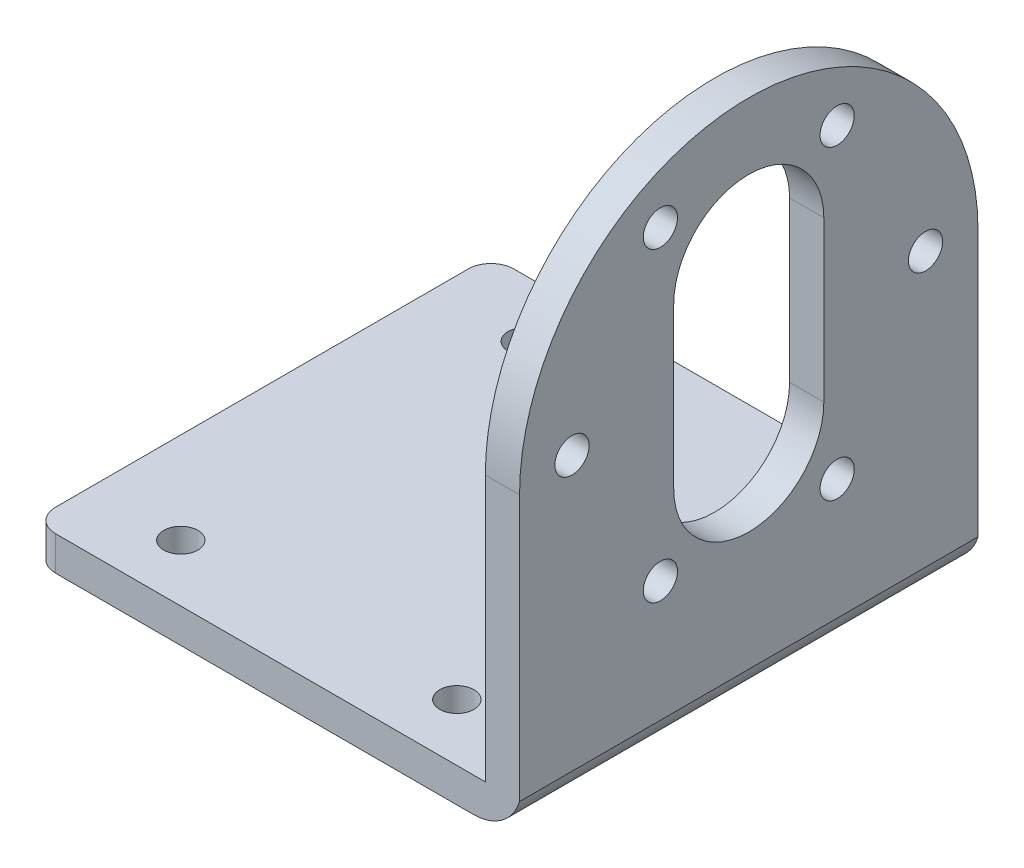
ISO-10303-21;
HEADER;
FILE_DESCRIPTION(('STEP AP214'),'2;1');
FILE_NAME('part.step','',(''),(''),'','','');
FILE_SCHEMA(('AUTOMOTIVE_DESIGN { 1 0 10303 214 1 1 1 1 }'));
ENDSEC;
DATA;
#1=APPLICATION_CONTEXT('core data for automotive mechanical design processes');
#2=APPLICATION_PROTOCOL_DEFINITION('international standard','automotive_design',2000,#1);
#3=PRODUCT_CONTEXT('',#1,'mechanical');
#4=PRODUCT('Part','Part','',(#3));
#5=PRODUCT_RELATED_PRODUCT_CATEGORY('part','',(#4));
#6=PRODUCT_DEFINITION_FORMATION('','',#4);
#7=PRODUCT_DEFINITION_CONTEXT('part definition',#1,'design');
#8=PRODUCT_DEFINITION('design','',#6,#7);
#9=PRODUCT_DEFINITION_SHAPE('','',#8);
#10=(LENGTH_UNIT() NAMED_UNIT(*) SI_UNIT(.MILLI.,.METRE.));
#11=(NAMED_UNIT(*) PLANE_ANGLE_UNIT() SI_UNIT($,.RADIAN.));
#12=(NAMED_UNIT(*) SI_UNIT($,.STERADIAN.) SOLID_ANGLE_UNIT());
#13=UNCERTAINTY_MEASURE_WITH_UNIT(LENGTH_MEASURE(1.E-05),#10,'distance_accuracy_value','');
#14=(GEOMETRIC_REPRESENTATION_CONTEXT(3) GLOBAL_UNCERTAINTY_ASSIGNED_CONTEXT((#13)) GLOBAL_UNIT_ASSIGNED_CONTEXT((#10,
#11,#12)) REPRESENTATION_CONTEXT('',''));
#15=CARTESIAN_POINT('',(0.,0.,0.));
#16=DIRECTION('',(0.,0.,1.));
#17=DIRECTION('',(1.,0.,0.));
#18=AXIS2_PLACEMENT_3D('',#15,#16,#17);
#19=CARTESIAN_POINT('',(0.,3.,40.2));
#20=DIRECTION('',(-1.,0.,0.));
#21=DIRECTION('',(0.,-1.,0.));
#22=AXIS2_PLACEMENT_3D('',#19,#20,#21);
#23=PLANE('',#22);
#24=CARTESIAN_POINT('',(0.,27.,35.6));
#25=DIRECTION('',(1.,0.,0.));
#26=DIRECTION('',(0.,1.,0.));
#27=AXIS2_PLACEMENT_3D('',#24,#25,#26);
#28=CIRCLE('',#27,1.5);
#29=CARTESIAN_POINT('',(0.,28.5,35.6));
#30=VERTEX_POINT('',#29);
#31=EDGE_CURVE('E234',#30,#30,#28,.T.);
#32=ORIENTED_EDGE('',*,*,#31,.F.);
#33=EDGE_LOOP('',(#32));
#34=FACE_BOUND('',#33,.T.);
#35=CARTESIAN_POINT('',(0.,13.5766062413413,27.8500000000002));
#36=DIRECTION('',(1.,0.,0.));
#37=DIRECTION('',(0.,1.,0.));
#38=AXIS2_PLACEMENT_3D('',#35,#36,#37);
#39=CIRCLE('',#38,1.50000000000001);
#40=CARTESIAN_POINT('',(0.,15.0766062413413,27.8500000000002));
#41=VERTEX_POINT('',#40);
#42=EDGE_CURVE('E402',#41,#41,#39,.T.);
#43=ORIENTED_EDGE('',*,*,#42,.F.);
#44=EDGE_LOOP('',(#43));
#45=FACE_BOUND('',#44,.T.);
#46=CARTESIAN_POINT('',(0.,13.5766062413411,12.3500000000001));
#47=DIRECTION('',(1.,0.,0.));
#48=DIRECTION('',(0.,1.,0.));
#49=AXIS2_PLACEMENT_3D('',#46,#47,#48);
#50=CIRCLE('',#49,1.5);
#51=CARTESIAN_POINT('',(0.,15.0766062413411,12.3500000000001));
#52=VERTEX_POINT('',#51);
#53=EDGE_CURVE('E409',#52,#52,#50,.T.);
#54=ORIENTED_EDGE('',*,*,#53,.F.);
#55=EDGE_LOOP('',(#54));
#56=FACE_BOUND('',#55,.T.);
#57=CARTESIAN_POINT('',(0.,26.9999999999999,4.6));
#58=DIRECTION('',(1.,0.,0.));
#59=DIRECTION('',(0.,1.,0.));
#60=AXIS2_PLACEMENT_3D('',#57,#58,#59);
#61=CIRCLE('',#60,1.50000000000001);
#62=CARTESIAN_POINT('',(0.,28.4999999999999,4.6));
#63=VERTEX_POINT('',#62);
#64=EDGE_CURVE('E415',#63,#63,#61,.T.);
#65=ORIENTED_EDGE('',*,*,#64,.F.);
#66=EDGE_LOOP('',(#65));
#67=FACE_BOUND('',#66,.T.);
#68=CARTESIAN_POINT('',(0.,40.4233937586588,12.3499999999999));
#69=DIRECTION('',(1.,0.,0.));
#70=DIRECTION('',(0.,1.,0.));
#71=AXIS2_PLACEMENT_3D('',#68,#69,#70);
#72=CIRCLE('',#71,1.5);
#73=CARTESIAN_POINT('',(0.,41.9233937586588,12.3499999999999));
#74=VERTEX_POINT('',#73);
#75=EDGE_CURVE('E412',#74,#74,#72,.T.);
#76=ORIENTED_EDGE('',*,*,#75,.F.);
#77=EDGE_LOOP('',(#76));
#78=FACE_BOUND('',#77,.T.);
#79=CARTESIAN_POINT('',(0.,40.4233937586588,27.85));
#80=DIRECTION('',(1.,0.,0.));
#81=DIRECTION('',(0.,1.,0.));
#82=AXIS2_PLACEMENT_3D('',#79,#80,#81);
#83=CIRCLE('',#82,1.5);
#84=CARTESIAN_POINT('',(0.,41.9233937586588,27.85));
#85=VERTEX_POINT('',#84);
#86=EDGE_CURVE('E406',#85,#85,#83,.T.);
#87=ORIENTED_EDGE('',*,*,#86,.F.);
#88=EDGE_LOOP('',(#87));
#89=FACE_BOUND('',#88,.T.);
#90=DIRECTION('',(0.,-1.,0.));
#91=VECTOR('',#90,1.);
#92=CARTESIAN_POINT('',(0.,34.,26.68));
#93=LINE('',#92,#91);
#94=CARTESIAN_POINT('',(0.,34.,26.68));
#95=VERTEX_POINT('',#94);
#96=CARTESIAN_POINT('',(0.,20.,26.68));
#97=VERTEX_POINT('',#96);
#98=EDGE_CURVE('E153',#95,#97,#93,.T.);
#99=ORIENTED_EDGE('',*,*,#98,.F.);
#100=CARTESIAN_POINT('',(0.,34.,20.1));
#101=DIRECTION('',(1.,0.,0.));
#102=DIRECTION('',(0.,1.,0.));
#103=AXIS2_PLACEMENT_3D('',#100,#101,#102);
#104=CIRCLE('',#103,6.58);
#105=CARTESIAN_POINT('',(0.,34.,13.52));
#106=VERTEX_POINT('',#105);
#107=EDGE_CURVE('E158',#106,#95,#104,.T.);
#108=ORIENTED_EDGE('',*,*,#107,.F.);
#109=DIRECTION('',(0.,1.,0.));
#110=VECTOR('',#109,1.);
#111=CARTESIAN_POINT('',(0.,34.,13.52));
#112=LINE('',#111,#110);
#113=CARTESIAN_POINT('',(0.,20.,13.52));
#114=VERTEX_POINT('',#113);
#115=EDGE_CURVE('E162',#114,#106,#112,.T.);
#116=ORIENTED_EDGE('',*,*,#115,.F.);
#117=CARTESIAN_POINT('',(0.,20.,20.1));
#118=DIRECTION('',(1.,0.,0.));
#119=DIRECTION('',(0.,1.,0.));
#120=AXIS2_PLACEMENT_3D('',#117,#118,#119);
#121=CIRCLE('',#120,6.58);
#122=EDGE_CURVE('E142',#97,#114,#121,.T.);
#123=ORIENTED_EDGE('',*,*,#122,.F.);
#124=EDGE_LOOP('',(#99,#108,#116,#123));
#125=FACE_BOUND('',#124,.T.);
#126=CARTESIAN_POINT('',(0.,26.3,20.1));
#127=DIRECTION('',(1.,0.,0.));
#128=DIRECTION('',(0.,1.,0.));
#129=AXIS2_PLACEMENT_3D('',#126,#127,#128);
#130=CIRCLE('',#129,20.1);
#131=CARTESIAN_POINT('',(0.,26.3,0.));
#132=VERTEX_POINT('',#131);
#133=CARTESIAN_POINT('',(0.,26.3,40.2));
#134=VERTEX_POINT('',#133);
#135=EDGE_CURVE('E169',#132,#134,#130,.T.);
#136=ORIENTED_EDGE('',*,*,#135,.T.);
#137=DIRECTION('',(0.,1.,0.));
#138=VECTOR('',#137,1.);
#139=CARTESIAN_POINT('',(0.,3.,40.2));
#140=LINE('',#139,#138);
#141=CARTESIAN_POINT('',(0.,3.,40.2));
#142=VERTEX_POINT('',#141);
#143=EDGE_CURVE('E179',#142,#134,#140,.T.);
#144=ORIENTED_EDGE('',*,*,#143,.F.);
#145=DIRECTION('',(0.,0.,-1.));
#146=VECTOR('',#145,1.);
#147=CARTESIAN_POINT('',(0.,3.,40.2));
#148=LINE('',#147,#146);
#149=CARTESIAN_POINT('',(0.,3.,0.));
#150=VERTEX_POINT('',#149);
#151=EDGE_CURVE('E211',#142,#150,#148,.T.);
#152=ORIENTED_EDGE('',*,*,#151,.T.);
#153=DIRECTION('',(0.,1.,0.));
#154=VECTOR('',#153,1.);
#155=CARTESIAN_POINT('',(0.,3.,0.));
#156=LINE('',#155,#154);
#157=EDGE_CURVE('E192',#150,#132,#156,.T.);
#158=ORIENTED_EDGE('',*,*,#157,.T.);
#159=EDGE_LOOP('',(#136,#144,#152,#158));
#160=FACE_BOUND('',#159,.T.);
#161=ADVANCED_FACE('F38',(#34,#45,#56,#67,#78,#89,#125,#160),#23,.F.);
#162=CARTESIAN_POINT('',(-3.,46.4,40.2));
#163=DIRECTION('',(1.,0.,0.));
#164=DIRECTION('',(0.,1.,0.));
#165=AXIS2_PLACEMENT_3D('',#162,#163,#164);
#166=PLANE('',#165);
#167=CARTESIAN_POINT('',(-3.,27.,35.6));
#168=DIRECTION('',(1.,0.,0.));
#169=DIRECTION('',(0.,1.,0.));
#170=AXIS2_PLACEMENT_3D('',#167,#168,#169);
#171=CIRCLE('',#170,1.5);
#172=CARTESIAN_POINT('',(-3.,28.5,35.6));
#173=VERTEX_POINT('',#172);
#174=EDGE_CURVE('E246',#173,#173,#171,.T.);
#175=ORIENTED_EDGE('',*,*,#174,.T.);
#176=EDGE_LOOP('',(#175));
#177=FACE_BOUND('',#176,.T.);
#178=CARTESIAN_POINT('',(-3.,13.5766062413413,27.8500000000002));
#179=DIRECTION('',(1.,0.,0.));
#180=DIRECTION('',(0.,1.,0.));
#181=AXIS2_PLACEMENT_3D('',#178,#179,#180);
#182=CIRCLE('',#181,1.50000000000001);
#183=CARTESIAN_POINT('',(-3.,15.0766062413413,27.8500000000002));
#184=VERTEX_POINT('',#183);
#185=EDGE_CURVE('E243',#184,#184,#182,.T.);
#186=ORIENTED_EDGE('',*,*,#185,.T.);
#187=EDGE_LOOP('',(#186));
#188=FACE_BOUND('',#187,.T.);
#189=CARTESIAN_POINT('',(-3.,13.5766062413411,12.3500000000001));
#190=DIRECTION('',(1.,0.,0.));
#191=DIRECTION('',(0.,1.,0.));
#192=AXIS2_PLACEMENT_3D('',#189,#190,#191);
#193=CIRCLE('',#192,1.5);
#194=CARTESIAN_POINT('',(-3.,15.0766062413411,12.3500000000001));
#195=VERTEX_POINT('',#194);
#196=EDGE_CURVE('E240',#195,#195,#193,.T.);
#197=ORIENTED_EDGE('',*,*,#196,.T.);
#198=EDGE_LOOP('',(#197));
#199=FACE_BOUND('',#198,.T.);
#200=CARTESIAN_POINT('',(-3.,26.9999999999999,4.6));
#201=DIRECTION('',(1.,0.,0.));
#202=DIRECTION('',(0.,1.,0.));
#203=AXIS2_PLACEMENT_3D('',#200,#201,#202);
#204=CIRCLE('',#203,1.50000000000001);
#205=CARTESIAN_POINT('',(-3.,28.4999999999999,4.6));
#206=VERTEX_POINT('',#205);
#207=EDGE_CURVE('E237',#206,#206,#204,.T.);
#208=ORIENTED_EDGE('',*,*,#207,.T.);
#209=EDGE_LOOP('',(#208));
#210=FACE_BOUND('',#209,.T.);
#211=CARTESIAN_POINT('',(-3.,40.4233937586588,12.3499999999999));
#212=DIRECTION('',(1.,0.,0.));
#213=DIRECTION('',(0.,1.,0.));
#214=AXIS2_PLACEMENT_3D('',#211,#212,#213);
#215=CIRCLE('',#214,1.5);
#216=CARTESIAN_POINT('',(-3.,41.9233937586588,12.3499999999999));
#217=VERTEX_POINT('',#216);
#218=EDGE_CURVE('E233',#217,#217,#215,.T.);
#219=ORIENTED_EDGE('',*,*,#218,.T.);
#220=EDGE_LOOP('',(#219));
#221=FACE_BOUND('',#220,.T.);
#222=CARTESIAN_POINT('',(-3.,40.4233937586588,27.85));
#223=DIRECTION('',(1.,0.,0.));
#224=DIRECTION('',(0.,1.,0.));
#225=AXIS2_PLACEMENT_3D('',#222,#223,#224);
#226=CIRCLE('',#225,1.5);
#227=CARTESIAN_POINT('',(-3.,41.9233937586588,27.85));
#228=VERTEX_POINT('',#227);
#229=EDGE_CURVE('E230',#228,#228,#226,.T.);
#230=ORIENTED_EDGE('',*,*,#229,.T.);
#231=EDGE_LOOP('',(#230));
#232=FACE_BOUND('',#231,.T.);
#233=DIRECTION('',(0.,1.,0.));
#234=VECTOR('',#233,1.);
#235=CARTESIAN_POINT('',(-3.,46.4,13.52));
#236=LINE('',#235,#234);
#237=CARTESIAN_POINT('',(-3.,20.,13.52));
#238=VERTEX_POINT('',#237);
#239=CARTESIAN_POINT('',(-3.,34.,13.52));
#240=VERTEX_POINT('',#239);
#241=EDGE_CURVE('E223',#238,#240,#236,.T.);
#242=ORIENTED_EDGE('',*,*,#241,.T.);
#243=CARTESIAN_POINT('',(-3.,34.,20.1));
#244=DIRECTION('',(1.,0.,0.));
#245=DIRECTION('',(0.,1.,0.));
#246=AXIS2_PLACEMENT_3D('',#243,#244,#245);
#247=CIRCLE('',#246,6.58);
#248=CARTESIAN_POINT('',(-3.,34.,26.68));
#249=VERTEX_POINT('',#248);
#250=EDGE_CURVE('E226',#240,#249,#247,.T.);
#251=ORIENTED_EDGE('',*,*,#250,.T.);
#252=DIRECTION('',(0.,-1.,0.));
#253=VECTOR('',#252,1.);
#254=CARTESIAN_POINT('',(-3.,46.4,26.68));
#255=LINE('',#254,#253);
#256=CARTESIAN_POINT('',(-3.,20.,26.68));
#257=VERTEX_POINT('',#256);
#258=EDGE_CURVE('E220',#249,#257,#255,.T.);
#259=ORIENTED_EDGE('',*,*,#258,.T.);
#260=CARTESIAN_POINT('',(-3.,20.,20.1));
#261=DIRECTION('',(1.,0.,0.));
#262=DIRECTION('',(0.,1.,0.));
#263=AXIS2_PLACEMENT_3D('',#260,#261,#262);
#264=CIRCLE('',#263,6.58);
#265=EDGE_CURVE('E145',#257,#238,#264,.T.);
#266=ORIENTED_EDGE('',*,*,#265,.T.);
#267=EDGE_LOOP('',(#242,#251,#259,#266));
#268=FACE_BOUND('',#267,.T.);
#269=DIRECTION('',(0.,-1.,0.));
#270=VECTOR('',#269,1.);
#271=CARTESIAN_POINT('',(-3.,46.4,40.2));
#272=LINE('',#271,#270);
#273=CARTESIAN_POINT('',(-3.,26.3,40.2));
#274=VERTEX_POINT('',#273);
#275=CARTESIAN_POINT('',(-2.99999999999999,3.00000000000001,40.2));
#276=VERTEX_POINT('',#275);
#277=EDGE_CURVE('E183',#274,#276,#272,.T.);
#278=ORIENTED_EDGE('',*,*,#277,.F.);
#279=CARTESIAN_POINT('',(-3.,26.3,20.1));
#280=DIRECTION('',(1.,0.,0.));
#281=DIRECTION('',(0.,1.,0.));
#282=AXIS2_PLACEMENT_3D('',#279,#280,#281);
#283=CIRCLE('',#282,20.1);
#284=CARTESIAN_POINT('',(-3.,26.3,0.));
#285=VERTEX_POINT('',#284);
#286=EDGE_CURVE('E173',#285,#274,#283,.T.);
#287=ORIENTED_EDGE('',*,*,#286,.F.);
#288=DIRECTION('',(0.,-1.,0.));
#289=VECTOR('',#288,1.);
#290=CARTESIAN_POINT('',(-3.,46.4,0.));
#291=LINE('',#290,#289);
#292=CARTESIAN_POINT('',(-2.99999999999999,3.00000000000001,0.));
#293=VERTEX_POINT('',#292);
#294=EDGE_CURVE('E195',#285,#293,#291,.T.);
#295=ORIENTED_EDGE('',*,*,#294,.T.);
#296=DIRECTION('',(0.,0.,-1.));
#297=VECTOR('',#296,1.);
#298=CARTESIAN_POINT('',(-2.99999999999999,3.00000000000001,40.2));
#299=LINE('',#298,#297);
#300=EDGE_CURVE('E208',#276,#293,#299,.T.);
#301=ORIENTED_EDGE('',*,*,#300,.F.);
#302=EDGE_LOOP('',(#278,#287,#295,#301));
#303=FACE_BOUND('',#302,.T.);
#304=ADVANCED_FACE('F292',(#177,#188,#199,#210,#221,#232,#268,#303),#166,.F.);
#305=CARTESIAN_POINT('',(-4.0422881334692,4.22334889233098,40.2));
#306=DIRECTION('',(0.,0.,-1.));
#307=DIRECTION('',(-1.,0.,0.));
#308=AXIS2_PLACEMENT_3D('',#305,#306,#307);
#309=CYLINDRICAL_SURFACE('',#308,4.22334889233098);
#310=CARTESIAN_POINT('',(-4.0422881334692,4.22334889233098,0.));
#311=DIRECTION('',(0.,0.,1.));
#312=DIRECTION('',(1.,0.,0.));
#313=AXIS2_PLACEMENT_3D('',#310,#311,#312);
#314=CIRCLE('',#313,4.22334889233098);
#315=CARTESIAN_POINT('',(-4.0422881334692,0.,0.));
#316=VERTEX_POINT('',#315);
#317=EDGE_CURVE('E175',#316,#150,#314,.T.);
#318=ORIENTED_EDGE('',*,*,#317,.T.);
#319=ORIENTED_EDGE('',*,*,#151,.F.);
#320=CARTESIAN_POINT('',(-4.0422881334692,4.22334889233098,40.2));
#321=DIRECTION('',(0.,0.,1.));
#322=DIRECTION('',(1.,0.,0.));
#323=AXIS2_PLACEMENT_3D('',#320,#321,#322);
#324=CIRCLE('',#323,4.22334889233098);
#325=CARTESIAN_POINT('',(-4.0422881334692,0.,40.2));
#326=VERTEX_POINT('',#325);
#327=EDGE_CURVE('E176',#326,#142,#324,.T.);
#328=ORIENTED_EDGE('',*,*,#327,.F.);
#329=DIRECTION('',(0.,0.,-1.));
#330=VECTOR('',#329,1.);
#331=CARTESIAN_POINT('',(-4.0422881334692,0.,40.2));
#332=LINE('',#331,#330);
#333=EDGE_CURVE('E189',#326,#316,#332,.T.);
#334=ORIENTED_EDGE('',*,*,#333,.T.);
#335=EDGE_LOOP('',(#318,#319,#328,#334));
#336=FACE_BOUND('',#335,.T.);
#337=ADVANCED_FACE('F274',(#336),#309,.T.);
#338=CARTESIAN_POINT('',(-2.99999999999999,3.00000000000001,40.2));
#339=DIRECTION('',(0.,-1.,0.));
#340=DIRECTION('',(1.,0.,0.));
#341=AXIS2_PLACEMENT_3D('',#338,#339,#340);
#342=PLANE('',#341);
#343=CARTESIAN_POINT('',(-34.7,3.,5.));
#344=DIRECTION('',(0.,1.,0.));
#345=DIRECTION('',(-1.,0.,0.));
#346=AXIS2_PLACEMENT_3D('',#343,#344,#345);
#347=CIRCLE('',#346,1.5);
#348=CARTESIAN_POINT('',(-36.2,3.,5.));
#349=VERTEX_POINT('',#348);
#350=EDGE_CURVE('E395',#349,#349,#347,.T.);
#351=ORIENTED_EDGE('',*,*,#350,.F.);
#352=EDGE_LOOP('',(#351));
#353=FACE_BOUND('',#352,.T.);
#354=CARTESIAN_POINT('',(-34.7,3.,35.2));
#355=DIRECTION('',(0.,1.,0.));
#356=DIRECTION('',(-1.,0.,0.));
#357=AXIS2_PLACEMENT_3D('',#354,#355,#356);
#358=CIRCLE('',#357,1.5);
#359=CARTESIAN_POINT('',(-36.2,3.,35.2));
#360=VERTEX_POINT('',#359);
#361=EDGE_CURVE('E387',#360,#360,#358,.T.);
#362=ORIENTED_EDGE('',*,*,#361,.F.);
#363=EDGE_LOOP('',(#362));
#364=FACE_BOUND('',#363,.T.);
#365=CARTESIAN_POINT('',(-10.5,3.,35.2));
#366=DIRECTION('',(0.,1.,0.));
#367=DIRECTION('',(-1.,0.,0.));
#368=AXIS2_PLACEMENT_3D('',#365,#366,#367);
#369=CIRCLE('',#368,1.5);
#370=CARTESIAN_POINT('',(-12.,3.,35.2));
#371=VERTEX_POINT('',#370);
#372=EDGE_CURVE('E380',#371,#371,#369,.T.);
#373=ORIENTED_EDGE('',*,*,#372,.F.);
#374=EDGE_LOOP('',(#373));
#375=FACE_BOUND('',#374,.T.);
#376=CARTESIAN_POINT('',(-10.5,3.,5.));
#377=DIRECTION('',(0.,1.,0.));
#378=DIRECTION('',(-1.,0.,0.));
#379=AXIS2_PLACEMENT_3D('',#376,#377,#378);
#380=CIRCLE('',#379,1.5);
#381=CARTESIAN_POINT('',(-12.,3.,5.));
#382=VERTEX_POINT('',#381);
#383=EDGE_CURVE('E382',#382,#382,#380,.T.);
#384=ORIENTED_EDGE('',*,*,#383,.F.);
#385=EDGE_LOOP('',(#384));
#386=FACE_BOUND('',#385,.T.);
#387=DIRECTION('',(-1.,0.,0.));
#388=VECTOR('',#387,1.);
#389=CARTESIAN_POINT('',(-2.99999999999999,3.00000000000001,0.));
#390=LINE('',#389,#388);
#391=CARTESIAN_POINT('',(-40.7,2.99999999999999,0.));
#392=VERTEX_POINT('',#391);
#393=EDGE_CURVE('E197',#293,#392,#390,.T.);
#394=ORIENTED_EDGE('',*,*,#393,.T.);
#395=CARTESIAN_POINT('',(-40.7,2.99999999999999,2.));
#396=DIRECTION('',(0.,-1.,0.));
#397=DIRECTION('',(1.,0.,0.));
#398=AXIS2_PLACEMENT_3D('',#395,#396,#397);
#399=CIRCLE('',#398,2.);
#400=CARTESIAN_POINT('',(-42.7,2.99999999999999,2.));
#401=VERTEX_POINT('',#400);
#402=EDGE_CURVE('E46',#392,#401,#399,.F.);
#403=ORIENTED_EDGE('',*,*,#402,.T.);
#404=DIRECTION('',(0.,0.,-1.));
#405=VECTOR('',#404,1.);
#406=CARTESIAN_POINT('',(-42.7,2.99999999999999,40.2));
#407=LINE('',#406,#405);
#408=CARTESIAN_POINT('',(-42.7,2.99999999999999,38.2));
#409=VERTEX_POINT('',#408);
#410=EDGE_CURVE('E205',#409,#401,#407,.T.);
#411=ORIENTED_EDGE('',*,*,#410,.F.);
#412=CARTESIAN_POINT('',(-40.7,2.99999999999999,38.2));
#413=DIRECTION('',(0.,-1.,0.));
#414=DIRECTION('',(1.,0.,0.));
#415=AXIS2_PLACEMENT_3D('',#412,#413,#414);
#416=CIRCLE('',#415,2.);
#417=CARTESIAN_POINT('',(-40.7,2.99999999999999,40.2));
#418=VERTEX_POINT('',#417);
#419=EDGE_CURVE('E53',#409,#418,#416,.F.);
#420=ORIENTED_EDGE('',*,*,#419,.T.);
#421=DIRECTION('',(-1.,0.,0.));
#422=VECTOR('',#421,1.);
#423=CARTESIAN_POINT('',(-2.99999999999999,3.00000000000001,40.2));
#424=LINE('',#423,#422);
#425=EDGE_CURVE('E185',#276,#418,#424,.T.);
#426=ORIENTED_EDGE('',*,*,#425,.F.);
#427=ORIENTED_EDGE('',*,*,#300,.T.);
#428=EDGE_LOOP('',(#394,#403,#411,#420,#426,#427));
#429=FACE_BOUND('',#428,.T.);
#430=ADVANCED_FACE('F259',(#353,#364,#375,#386,#429),#342,.F.);
#431=CARTESIAN_POINT('',(-42.7,0.,40.2));
#432=DIRECTION('',(1.,0.,0.));
#433=DIRECTION('',(0.,0.,-1.));
#434=AXIS2_PLACEMENT_3D('',#431,#432,#433);
#435=PLANE('',#434);
#436=ORIENTED_EDGE('',*,*,#410,.T.);
#437=DIRECTION('',(0.,-1.,0.));
#438=VECTOR('',#437,1.);
#439=CARTESIAN_POINT('',(-42.7,0.,2.));
#440=LINE('',#439,#438);
#441=CARTESIAN_POINT('',(-42.7,0.,2.));
#442=VERTEX_POINT('',#441);
#443=EDGE_CURVE('E250',#401,#442,#440,.T.);
#444=ORIENTED_EDGE('',*,*,#443,.T.);
#445=DIRECTION('',(0.,0.,-1.));
#446=VECTOR('',#445,1.);
#447=CARTESIAN_POINT('',(-42.7,0.,40.2));
#448=LINE('',#447,#446);
#449=CARTESIAN_POINT('',(-42.7,0.,38.2));
#450=VERTEX_POINT('',#449);
#451=EDGE_CURVE('E202',#450,#442,#448,.T.);
#452=ORIENTED_EDGE('',*,*,#451,.F.);
#453=DIRECTION('',(0.,-1.,0.));
#454=VECTOR('',#453,1.);
#455=CARTESIAN_POINT('',(-42.7,2.99999999999999,38.2));
#456=LINE('',#455,#454);
#457=EDGE_CURVE('E229',#450,#409,#456,.F.);
#458=ORIENTED_EDGE('',*,*,#457,.T.);
#459=EDGE_LOOP('',(#436,#444,#452,#458));
#460=FACE_BOUND('',#459,.T.);
#461=ADVANCED_FACE('F263',(#460),#435,.F.);
#462=CARTESIAN_POINT('',(-4.0422881334692,0.,40.2));
#463=DIRECTION('',(0.,1.,0.));
#464=DIRECTION('',(-1.,0.,0.));
#465=AXIS2_PLACEMENT_3D('',#462,#463,#464);
#466=PLANE('',#465);
#467=CARTESIAN_POINT('',(-34.7,0.,5.));
#468=DIRECTION('',(0.,1.,0.));
#469=DIRECTION('',(-1.,0.,0.));
#470=AXIS2_PLACEMENT_3D('',#467,#468,#469);
#471=CIRCLE('',#470,1.5);
#472=CARTESIAN_POINT('',(-36.2,0.,5.));
#473=VERTEX_POINT('',#472);
#474=EDGE_CURVE('E398',#473,#473,#471,.T.);
#475=ORIENTED_EDGE('',*,*,#474,.T.);
#476=EDGE_LOOP('',(#475));
#477=FACE_BOUND('',#476,.T.);
#478=CARTESIAN_POINT('',(-34.7,0.,35.2));
#479=DIRECTION('',(0.,1.,0.));
#480=DIRECTION('',(-1.,0.,0.));
#481=AXIS2_PLACEMENT_3D('',#478,#479,#480);
#482=CIRCLE('',#481,1.5);
#483=CARTESIAN_POINT('',(-36.2,0.,35.2));
#484=VERTEX_POINT('',#483);
#485=EDGE_CURVE('E392',#484,#484,#482,.T.);
#486=ORIENTED_EDGE('',*,*,#485,.T.);
#487=EDGE_LOOP('',(#486));
#488=FACE_BOUND('',#487,.T.);
#489=CARTESIAN_POINT('',(-10.5,0.,35.2));
#490=DIRECTION('',(0.,1.,0.));
#491=DIRECTION('',(-1.,0.,0.));
#492=AXIS2_PLACEMENT_3D('',#489,#490,#491);
#493=CIRCLE('',#492,1.5);
#494=CARTESIAN_POINT('',(-12.,0.,35.2));
#495=VERTEX_POINT('',#494);
#496=EDGE_CURVE('E377',#495,#495,#493,.T.);
#497=ORIENTED_EDGE('',*,*,#496,.T.);
#498=EDGE_LOOP('',(#497));
#499=FACE_BOUND('',#498,.T.);
#500=CARTESIAN_POINT('',(-10.5,0.,5.));
#501=DIRECTION('',(0.,1.,0.));
#502=DIRECTION('',(-1.,0.,0.));
#503=AXIS2_PLACEMENT_3D('',#500,#501,#502);
#504=CIRCLE('',#503,1.5);
#505=CARTESIAN_POINT('',(-12.,0.,5.));
#506=VERTEX_POINT('',#505);
#507=EDGE_CURVE('E385',#506,#506,#504,.T.);
#508=ORIENTED_EDGE('',*,*,#507,.T.);
#509=EDGE_LOOP('',(#508));
#510=FACE_BOUND('',#509,.T.);
#511=ORIENTED_EDGE('',*,*,#451,.T.);
#512=CARTESIAN_POINT('',(-40.7,0.,2.));
#513=DIRECTION('',(0.,1.,0.));
#514=DIRECTION('',(-1.,0.,0.));
#515=AXIS2_PLACEMENT_3D('',#512,#513,#514);
#516=CIRCLE('',#515,2.);
#517=CARTESIAN_POINT('',(-40.7,0.,0.));
#518=VERTEX_POINT('',#517);
#519=EDGE_CURVE('E255',#442,#518,#516,.F.);
#520=ORIENTED_EDGE('',*,*,#519,.T.);
#521=DIRECTION('',(1.,0.,0.));
#522=VECTOR('',#521,1.);
#523=CARTESIAN_POINT('',(-4.0422881334692,0.,0.));
#524=LINE('',#523,#522);
#525=EDGE_CURVE('E180',#518,#316,#524,.T.);
#526=ORIENTED_EDGE('',*,*,#525,.T.);
#527=ORIENTED_EDGE('',*,*,#333,.F.);
#528=DIRECTION('',(1.,0.,0.));
#529=VECTOR('',#528,1.);
#530=CARTESIAN_POINT('',(-4.0422881334692,0.,40.2));
#531=LINE('',#530,#529);
#532=CARTESIAN_POINT('',(-40.7,0.,40.2));
#533=VERTEX_POINT('',#532);
#534=EDGE_CURVE('E187',#533,#326,#531,.T.);
#535=ORIENTED_EDGE('',*,*,#534,.F.);
#536=CARTESIAN_POINT('',(-40.7,0.,38.2));
#537=DIRECTION('',(0.,1.,0.));
#538=DIRECTION('',(-1.,0.,0.));
#539=AXIS2_PLACEMENT_3D('',#536,#537,#538);
#540=CIRCLE('',#539,2.);
#541=EDGE_CURVE('E253',#533,#450,#540,.F.);
#542=ORIENTED_EDGE('',*,*,#541,.T.);
#543=EDGE_LOOP('',(#511,#520,#526,#527,#535,#542));
#544=FACE_BOUND('',#543,.T.);
#545=ADVANCED_FACE('F268',(#477,#488,#499,#510,#544),#466,.F.);
#546=CARTESIAN_POINT('',(-4.0422881334692,4.22334889233098,40.2));
#547=DIRECTION('',(0.,0.,1.));
#548=DIRECTION('',(1.,0.,0.));
#549=AXIS2_PLACEMENT_3D('',#546,#547,#548);
#550=PLANE('',#549);
#551=ORIENTED_EDGE('',*,*,#425,.T.);
#552=DIRECTION('',(0.,-1.,0.));
#553=VECTOR('',#552,1.);
#554=CARTESIAN_POINT('',(-40.7,0.,40.2));
#555=LINE('',#554,#553);
#556=EDGE_CURVE('E12',#418,#533,#555,.T.);
#557=ORIENTED_EDGE('',*,*,#556,.T.);
#558=ORIENTED_EDGE('',*,*,#534,.T.);
#559=ORIENTED_EDGE('',*,*,#327,.T.);
#560=ORIENTED_EDGE('',*,*,#143,.T.);
#561=DIRECTION('',(1.,0.,0.));
#562=VECTOR('',#561,1.);
#563=CARTESIAN_POINT('',(-40.,26.3,40.2));
#564=LINE('',#563,#562);
#565=EDGE_CURVE('E217',#274,#134,#564,.T.);
#566=ORIENTED_EDGE('',*,*,#565,.F.);
#567=ORIENTED_EDGE('',*,*,#277,.T.);
#568=EDGE_LOOP('',(#551,#557,#558,#559,#560,#566,#567));
#569=FACE_BOUND('',#568,.T.);
#570=ADVANCED_FACE('F278',(#569),#550,.T.);
#571=CARTESIAN_POINT('',(-4.0422881334692,4.22334889233098,0.));
#572=DIRECTION('',(0.,0.,1.));
#573=DIRECTION('',(1.,0.,0.));
#574=AXIS2_PLACEMENT_3D('',#571,#572,#573);
#575=PLANE('',#574);
#576=ORIENTED_EDGE('',*,*,#525,.F.);
#577=DIRECTION('',(0.,-1.,0.));
#578=VECTOR('',#577,1.);
#579=CARTESIAN_POINT('',(-40.7,4.22334889233098,0.));
#580=LINE('',#579,#578);
#581=EDGE_CURVE('E61',#518,#392,#580,.F.);
#582=ORIENTED_EDGE('',*,*,#581,.T.);
#583=ORIENTED_EDGE('',*,*,#393,.F.);
#584=ORIENTED_EDGE('',*,*,#294,.F.);
#585=DIRECTION('',(1.,0.,0.));
#586=VECTOR('',#585,1.);
#587=CARTESIAN_POINT('',(-40.,26.3,0.));
#588=LINE('',#587,#586);
#589=EDGE_CURVE('E214',#285,#132,#588,.T.);
#590=ORIENTED_EDGE('',*,*,#589,.T.);
#591=ORIENTED_EDGE('',*,*,#157,.F.);
#592=ORIENTED_EDGE('',*,*,#317,.F.);
#593=EDGE_LOOP('',(#576,#582,#583,#584,#590,#591,#592));
#594=FACE_BOUND('',#593,.T.);
#595=ADVANCED_FACE('F271',(#594),#575,.F.);
#596=CARTESIAN_POINT('',(-40.,26.3,20.1));
#597=DIRECTION('',(1.,0.,0.));
#598=DIRECTION('',(0.,1.,0.));
#599=AXIS2_PLACEMENT_3D('',#596,#597,#598);
#600=CYLINDRICAL_SURFACE('',#599,20.1);
#601=ORIENTED_EDGE('',*,*,#286,.T.);
#602=ORIENTED_EDGE('',*,*,#565,.T.);
#603=ORIENTED_EDGE('',*,*,#135,.F.);
#604=ORIENTED_EDGE('',*,*,#589,.F.);
#605=EDGE_LOOP('',(#601,#602,#603,#604));
#606=FACE_BOUND('',#605,.T.);
#607=ADVANCED_FACE('F321',(#606),#600,.T.);
#608=CARTESIAN_POINT('',(-40.,34.,20.1));
#609=DIRECTION('',(1.,0.,0.));
#610=DIRECTION('',(0.,1.,0.));
#611=AXIS2_PLACEMENT_3D('',#608,#609,#610);
#612=CYLINDRICAL_SURFACE('',#611,6.58);
#613=DIRECTION('',(1.,0.,0.));
#614=VECTOR('',#613,1.);
#615=CARTESIAN_POINT('',(-40.,34.,13.52));
#616=LINE('',#615,#614);
#617=EDGE_CURVE('E167',#240,#106,#616,.T.);
#618=ORIENTED_EDGE('',*,*,#617,.T.);
#619=ORIENTED_EDGE('',*,*,#107,.T.);
#620=DIRECTION('',(1.,0.,0.));
#621=VECTOR('',#620,1.);
#622=CARTESIAN_POINT('',(-40.,34.,26.68));
#623=LINE('',#622,#621);
#624=EDGE_CURVE('E149',#249,#95,#623,.T.);
#625=ORIENTED_EDGE('',*,*,#624,.F.);
#626=ORIENTED_EDGE('',*,*,#250,.F.);
#627=EDGE_LOOP('',(#618,#619,#625,#626));
#628=FACE_BOUND('',#627,.T.);
#629=ADVANCED_FACE('F326',(#628),#612,.F.);
#630=CARTESIAN_POINT('',(-40.,34.,13.52));
#631=DIRECTION('',(0.,0.,-1.));
#632=DIRECTION('',(0.,1.,0.));
#633=AXIS2_PLACEMENT_3D('',#630,#631,#632);
#634=PLANE('',#633);
#635=DIRECTION('',(1.,0.,0.));
#636=VECTOR('',#635,1.);
#637=CARTESIAN_POINT('',(-40.,20.,13.52));
#638=LINE('',#637,#636);
#639=EDGE_CURVE('E148',#238,#114,#638,.T.);
#640=ORIENTED_EDGE('',*,*,#639,.T.);
#641=ORIENTED_EDGE('',*,*,#115,.T.);
#642=ORIENTED_EDGE('',*,*,#617,.F.);
#643=ORIENTED_EDGE('',*,*,#241,.F.);
#644=EDGE_LOOP('',(#640,#641,#642,#643));
#645=FACE_BOUND('',#644,.T.);
#646=ADVANCED_FACE('F330',(#645),#634,.F.);
#647=CARTESIAN_POINT('',(-40.,20.,20.1));
#648=DIRECTION('',(1.,0.,0.));
#649=DIRECTION('',(0.,1.,0.));
#650=AXIS2_PLACEMENT_3D('',#647,#648,#649);
#651=CYLINDRICAL_SURFACE('',#650,6.58);
#652=DIRECTION('',(1.,0.,0.));
#653=VECTOR('',#652,1.);
#654=CARTESIAN_POINT('',(-40.,20.,26.68));
#655=LINE('',#654,#653);
#656=EDGE_CURVE('E137',#257,#97,#655,.T.);
#657=ORIENTED_EDGE('',*,*,#656,.T.);
#658=ORIENTED_EDGE('',*,*,#122,.T.);
#659=ORIENTED_EDGE('',*,*,#639,.F.);
#660=ORIENTED_EDGE('',*,*,#265,.F.);
#661=EDGE_LOOP('',(#657,#658,#659,#660));
#662=FACE_BOUND('',#661,.T.);
#663=ADVANCED_FACE('F139',(#662),#651,.F.);
#664=CARTESIAN_POINT('',(-40.,34.,26.68));
#665=DIRECTION('',(0.,0.,1.));
#666=DIRECTION('',(1.,0.,0.));
#667=AXIS2_PLACEMENT_3D('',#664,#665,#666);
#668=PLANE('',#667);
#669=ORIENTED_EDGE('',*,*,#624,.T.);
#670=ORIENTED_EDGE('',*,*,#98,.T.);
#671=ORIENTED_EDGE('',*,*,#656,.F.);
#672=ORIENTED_EDGE('',*,*,#258,.F.);
#673=EDGE_LOOP('',(#669,#670,#671,#672));
#674=FACE_BOUND('',#673,.T.);
#675=ADVANCED_FACE('F154',(#674),#668,.F.);
#676=CARTESIAN_POINT('',(-40.,40.4233937586588,27.85));
#677=DIRECTION('',(1.,0.,0.));
#678=DIRECTION('',(0.,1.,0.));
#679=AXIS2_PLACEMENT_3D('',#676,#677,#678);
#680=CYLINDRICAL_SURFACE('',#679,1.5);
#681=ORIENTED_EDGE('',*,*,#86,.T.);
#682=EDGE_LOOP('',(#681));
#683=FACE_BOUND('',#682,.T.);
#684=ORIENTED_EDGE('',*,*,#229,.F.);
#685=EDGE_LOOP('',(#684));
#686=FACE_BOUND('',#685,.T.);
#687=ADVANCED_FACE('F334',(#683,#686),#680,.F.);
#688=CARTESIAN_POINT('',(-40.,40.4233937586588,12.3499999999999));
#689=DIRECTION('',(1.,0.,0.));
#690=DIRECTION('',(0.,1.,0.));
#691=AXIS2_PLACEMENT_3D('',#688,#689,#690);
#692=CYLINDRICAL_SURFACE('',#691,1.5);
#693=ORIENTED_EDGE('',*,*,#75,.T.);
#694=EDGE_LOOP('',(#693));
#695=FACE_BOUND('',#694,.T.);
#696=ORIENTED_EDGE('',*,*,#218,.F.);
#697=EDGE_LOOP('',(#696));
#698=FACE_BOUND('',#697,.T.);
#699=ADVANCED_FACE('F348',(#695,#698),#692,.F.);
#700=CARTESIAN_POINT('',(-40.,26.9999999999999,4.6));
#701=DIRECTION('',(1.,0.,0.));
#702=DIRECTION('',(0.,1.,0.));
#703=AXIS2_PLACEMENT_3D('',#700,#701,#702);
#704=CYLINDRICAL_SURFACE('',#703,1.50000000000001);
#705=ORIENTED_EDGE('',*,*,#64,.T.);
#706=EDGE_LOOP('',(#705));
#707=FACE_BOUND('',#706,.T.);
#708=ORIENTED_EDGE('',*,*,#207,.F.);
#709=EDGE_LOOP('',(#708));
#710=FACE_BOUND('',#709,.T.);
#711=ADVANCED_FACE('F344',(#707,#710),#704,.F.);
#712=CARTESIAN_POINT('',(-40.,13.5766062413411,12.3500000000001));
#713=DIRECTION('',(1.,0.,0.));
#714=DIRECTION('',(0.,1.,0.));
#715=AXIS2_PLACEMENT_3D('',#712,#713,#714);
#716=CYLINDRICAL_SURFACE('',#715,1.5);
#717=ORIENTED_EDGE('',*,*,#53,.T.);
#718=EDGE_LOOP('',(#717));
#719=FACE_BOUND('',#718,.T.);
#720=ORIENTED_EDGE('',*,*,#196,.F.);
#721=EDGE_LOOP('',(#720));
#722=FACE_BOUND('',#721,.T.);
#723=ADVANCED_FACE('F340',(#719,#722),#716,.F.);
#724=CARTESIAN_POINT('',(-40.,13.5766062413413,27.8500000000002));
#725=DIRECTION('',(1.,0.,0.));
#726=DIRECTION('',(0.,1.,0.));
#727=AXIS2_PLACEMENT_3D('',#724,#725,#726);
#728=CYLINDRICAL_SURFACE('',#727,1.50000000000001);
#729=ORIENTED_EDGE('',*,*,#42,.T.);
#730=EDGE_LOOP('',(#729));
#731=FACE_BOUND('',#730,.T.);
#732=ORIENTED_EDGE('',*,*,#185,.F.);
#733=EDGE_LOOP('',(#732));
#734=FACE_BOUND('',#733,.T.);
#735=ADVANCED_FACE('F343',(#731,#734),#728,.F.);
#736=CARTESIAN_POINT('',(-40.,27.,35.6));
#737=DIRECTION('',(1.,0.,0.));
#738=DIRECTION('',(0.,1.,0.));
#739=AXIS2_PLACEMENT_3D('',#736,#737,#738);
#740=CYLINDRICAL_SURFACE('',#739,1.5);
#741=ORIENTED_EDGE('',*,*,#31,.T.);
#742=EDGE_LOOP('',(#741));
#743=FACE_BOUND('',#742,.T.);
#744=ORIENTED_EDGE('',*,*,#174,.F.);
#745=EDGE_LOOP('',(#744));
#746=FACE_BOUND('',#745,.T.);
#747=ADVANCED_FACE('F290',(#743,#746),#740,.F.);
#748=CARTESIAN_POINT('',(-40.7,0.,2.));
#749=DIRECTION('',(0.,-1.,0.));
#750=DIRECTION('',(0.,0.,-1.));
#751=AXIS2_PLACEMENT_3D('',#748,#749,#750);
#752=CYLINDRICAL_SURFACE('',#751,2.);
#753=ORIENTED_EDGE('',*,*,#402,.F.);
#754=ORIENTED_EDGE('',*,*,#581,.F.);
#755=ORIENTED_EDGE('',*,*,#519,.F.);
#756=ORIENTED_EDGE('',*,*,#443,.F.);
#757=EDGE_LOOP('',(#753,#754,#755,#756));
#758=FACE_BOUND('',#757,.T.);
#759=ADVANCED_FACE('F266',(#758),#752,.T.);
#760=CARTESIAN_POINT('',(-40.7,4.22334889233098,38.2));
#761=DIRECTION('',(0.,1.,0.));
#762=DIRECTION('',(0.,0.,1.));
#763=AXIS2_PLACEMENT_3D('',#760,#761,#762);
#764=CYLINDRICAL_SURFACE('',#763,2.);
#765=ORIENTED_EDGE('',*,*,#419,.F.);
#766=ORIENTED_EDGE('',*,*,#457,.F.);
#767=ORIENTED_EDGE('',*,*,#541,.F.);
#768=ORIENTED_EDGE('',*,*,#556,.F.);
#769=EDGE_LOOP('',(#765,#766,#767,#768));
#770=FACE_BOUND('',#769,.T.);
#771=ADVANCED_FACE('F40',(#770),#764,.T.);
#772=CARTESIAN_POINT('',(-10.5,0.,5.));
#773=DIRECTION('',(0.,1.,0.));
#774=DIRECTION('',(-1.,0.,0.));
#775=AXIS2_PLACEMENT_3D('',#772,#773,#774);
#776=CYLINDRICAL_SURFACE('',#775,1.5);
#777=ORIENTED_EDGE('',*,*,#507,.F.);
#778=EDGE_LOOP('',(#777));
#779=FACE_BOUND('',#778,.T.);
#780=ORIENTED_EDGE('',*,*,#383,.T.);
#781=EDGE_LOOP('',(#780));
#782=FACE_BOUND('',#781,.T.);
#783=ADVANCED_FACE('F282',(#779,#782),#776,.F.);
#784=CARTESIAN_POINT('',(-10.5,0.,35.2));
#785=DIRECTION('',(0.,1.,0.));
#786=DIRECTION('',(-1.,0.,0.));
#787=AXIS2_PLACEMENT_3D('',#784,#785,#786);
#788=CYLINDRICAL_SURFACE('',#787,1.5);
#789=ORIENTED_EDGE('',*,*,#496,.F.);
#790=EDGE_LOOP('',(#789));
#791=FACE_BOUND('',#790,.T.);
#792=ORIENTED_EDGE('',*,*,#372,.T.);
#793=EDGE_LOOP('',(#792));
#794=FACE_BOUND('',#793,.T.);
#795=ADVANCED_FACE('F287',(#791,#794),#788,.F.);
#796=CARTESIAN_POINT('',(-34.7,0.,35.2));
#797=DIRECTION('',(0.,1.,0.));
#798=DIRECTION('',(-1.,0.,0.));
#799=AXIS2_PLACEMENT_3D('',#796,#797,#798);
#800=CYLINDRICAL_SURFACE('',#799,1.5);
#801=ORIENTED_EDGE('',*,*,#485,.F.);
#802=EDGE_LOOP('',(#801));
#803=FACE_BOUND('',#802,.T.);
#804=ORIENTED_EDGE('',*,*,#361,.T.);
#805=EDGE_LOOP('',(#804));
#806=FACE_BOUND('',#805,.T.);
#807=ADVANCED_FACE('F365',(#803,#806),#800,.F.);
#808=CARTESIAN_POINT('',(-34.7,0.,5.));
#809=DIRECTION('',(0.,1.,0.));
#810=DIRECTION('',(-1.,0.,0.));
#811=AXIS2_PLACEMENT_3D('',#808,#809,#810);
#812=CYLINDRICAL_SURFACE('',#811,1.5);
#813=ORIENTED_EDGE('',*,*,#474,.F.);
#814=EDGE_LOOP('',(#813));
#815=FACE_BOUND('',#814,.T.);
#816=ORIENTED_EDGE('',*,*,#350,.T.);
#817=EDGE_LOOP('',(#816));
#818=FACE_BOUND('',#817,.T.);
#819=ADVANCED_FACE('F362',(#815,#818),#812,.F.);
#820=CLOSED_SHELL('',(#161,#304,#337,#430,#461,#545,#570,#595,#607,#629,#646,#663,#675,#687,
#699,#711,#723,#735,#747,#759,#771,#783,#795,#807,#819));
#821=MANIFOLD_SOLID_BREP('B2',#820);
#822=ADVANCED_BREP_SHAPE_REPRESENTATION('',(#18,#821),#14);
#823=SHAPE_DEFINITION_REPRESENTATION(#9,#822);
ENDSEC;
END-ISO-10303-21;
